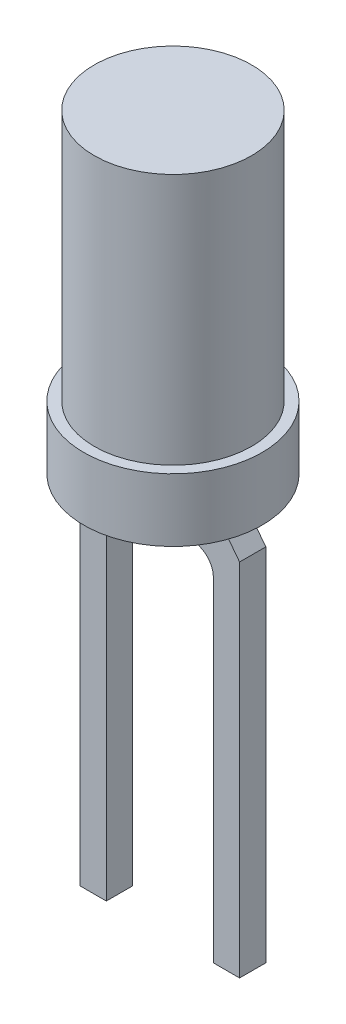
ISO-10303-21;
HEADER;
FILE_DESCRIPTION(('STEP AP214'),'2;1');
FILE_NAME('part.step','',(''),(''),'','','');
FILE_SCHEMA(('AUTOMOTIVE_DESIGN { 1 0 10303 214 1 1 1 1 }'));
ENDSEC;
DATA;
#1=APPLICATION_CONTEXT('core data for automotive mechanical design processes');
#2=APPLICATION_PROTOCOL_DEFINITION('international standard','automotive_design',2000,#1);
#3=PRODUCT_CONTEXT('',#1,'mechanical');
#4=PRODUCT('Part','Part','',(#3));
#5=PRODUCT_RELATED_PRODUCT_CATEGORY('part','',(#4));
#6=PRODUCT_DEFINITION_FORMATION('','',#4);
#7=PRODUCT_DEFINITION_CONTEXT('part definition',#1,'design');
#8=PRODUCT_DEFINITION('design','',#6,#7);
#9=PRODUCT_DEFINITION_SHAPE('','',#8);
#10=(LENGTH_UNIT() NAMED_UNIT(*) SI_UNIT(.MILLI.,.METRE.));
#11=(NAMED_UNIT(*) PLANE_ANGLE_UNIT() SI_UNIT($,.RADIAN.));
#12=(NAMED_UNIT(*) SI_UNIT($,.STERADIAN.) SOLID_ANGLE_UNIT());
#13=UNCERTAINTY_MEASURE_WITH_UNIT(LENGTH_MEASURE(1.E-05),#10,'distance_accuracy_value','');
#14=(GEOMETRIC_REPRESENTATION_CONTEXT(3) GLOBAL_UNCERTAINTY_ASSIGNED_CONTEXT((#13)) GLOBAL_UNIT_ASSIGNED_CONTEXT((#10,
#11,#12)) REPRESENTATION_CONTEXT('',''));
#15=CARTESIAN_POINT('',(0.,0.,0.));
#16=DIRECTION('',(0.,0.,1.));
#17=DIRECTION('',(1.,0.,0.));
#18=AXIS2_PLACEMENT_3D('',#15,#16,#17);
#19=CARTESIAN_POINT('',(0.,-6.,0.));
#20=DIRECTION('',(0.,-1.,0.));
#21=DIRECTION('',(0.,0.,-1.));
#22=AXIS2_PLACEMENT_3D('',#19,#20,#21);
#23=PLANE('',#22);
#24=CARTESIAN_POINT('',(0.,-6.,0.));
#25=DIRECTION('',(0.,-1.,0.));
#26=DIRECTION('',(0.,0.,-1.));
#27=AXIS2_PLACEMENT_3D('',#24,#25,#26);
#28=CIRCLE('',#27,1.7);
#29=CARTESIAN_POINT('',(0.,-6.,-1.7));
#30=VERTEX_POINT('',#29);
#31=EDGE_CURVE('E294',#30,#30,#28,.T.);
#32=ORIENTED_EDGE('',*,*,#31,.T.);
#33=EDGE_LOOP('',(#32));
#34=FACE_BOUND('',#33,.T.);
#35=DIRECTION('',(-1.,0.,0.));
#36=VECTOR('',#35,1.);
#37=CARTESIAN_POINT('',(1.08406668238665,-6.,-0.25));
#38=LINE('',#37,#36);
#39=CARTESIAN_POINT('',(1.08406668238665,-6.,-0.25));
#40=VERTEX_POINT('',#39);
#41=CARTESIAN_POINT('',(0.5,-6.,-0.25));
#42=VERTEX_POINT('',#41);
#43=EDGE_CURVE('E247',#40,#42,#38,.T.);
#44=ORIENTED_EDGE('',*,*,#43,.T.);
#45=DIRECTION('',(0.,0.,1.));
#46=VECTOR('',#45,1.);
#47=CARTESIAN_POINT('',(0.5,-6.,-0.25));
#48=LINE('',#47,#46);
#49=CARTESIAN_POINT('',(0.5,-6.,0.25));
#50=VERTEX_POINT('',#49);
#51=EDGE_CURVE('E274',#42,#50,#48,.T.);
#52=ORIENTED_EDGE('',*,*,#51,.T.);
#53=DIRECTION('',(-1.,0.,0.));
#54=VECTOR('',#53,1.);
#55=CARTESIAN_POINT('',(1.08406668238665,-6.,0.25));
#56=LINE('',#55,#54);
#57=CARTESIAN_POINT('',(1.08406668238665,-6.,0.25));
#58=VERTEX_POINT('',#57);
#59=EDGE_CURVE('E211',#58,#50,#56,.T.);
#60=ORIENTED_EDGE('',*,*,#59,.F.);
#61=DIRECTION('',(0.,0.,1.));
#62=VECTOR('',#61,1.);
#63=CARTESIAN_POINT('',(1.08406668238665,-6.,-0.25));
#64=LINE('',#63,#62);
#65=EDGE_CURVE('E275',#40,#58,#64,.T.);
#66=ORIENTED_EDGE('',*,*,#65,.F.);
#67=EDGE_LOOP('',(#44,#52,#60,#66));
#68=FACE_BOUND('',#67,.T.);
#69=DIRECTION('',(0.,0.,1.));
#70=VECTOR('',#69,1.);
#71=CARTESIAN_POINT('',(-0.5,-6.,-0.25));
#72=LINE('',#71,#70);
#73=CARTESIAN_POINT('',(-0.5,-6.,-0.25));
#74=VERTEX_POINT('',#73);
#75=CARTESIAN_POINT('',(-0.5,-6.,0.25));
#76=VERTEX_POINT('',#75);
#77=EDGE_CURVE('E57',#74,#76,#72,.T.);
#78=ORIENTED_EDGE('',*,*,#77,.F.);
#79=DIRECTION('',(-1.,0.,0.));
#80=VECTOR('',#79,1.);
#81=CARTESIAN_POINT('',(-1.08406668238665,-6.,-0.25));
#82=LINE('',#81,#80);
#83=CARTESIAN_POINT('',(-1.08406668238665,-6.,-0.25));
#84=VERTEX_POINT('',#83);
#85=EDGE_CURVE('E52',#74,#84,#82,.T.);
#86=ORIENTED_EDGE('',*,*,#85,.T.);
#87=DIRECTION('',(0.,0.,1.));
#88=VECTOR('',#87,1.);
#89=CARTESIAN_POINT('',(-1.08406668238665,-6.,-0.25));
#90=LINE('',#89,#88);
#91=CARTESIAN_POINT('',(-1.08406668238665,-6.,0.25));
#92=VERTEX_POINT('',#91);
#93=EDGE_CURVE('E218',#84,#92,#90,.T.);
#94=ORIENTED_EDGE('',*,*,#93,.T.);
#95=DIRECTION('',(-1.,0.,0.));
#96=VECTOR('',#95,1.);
#97=CARTESIAN_POINT('',(-1.08406668238665,-6.,0.25));
#98=LINE('',#97,#96);
#99=EDGE_CURVE('E179',#76,#92,#98,.T.);
#100=ORIENTED_EDGE('',*,*,#99,.F.);
#101=EDGE_LOOP('',(#78,#86,#94,#100));
#102=FACE_BOUND('',#101,.T.);
#103=ADVANCED_FACE('F37',(#34,#68,#102),#23,.T.);
#104=CARTESIAN_POINT('',(0.,-4.8,0.));
#105=DIRECTION('',(0.,1.,0.));
#106=DIRECTION('',(0.,0.,1.));
#107=AXIS2_PLACEMENT_3D('',#104,#105,#106);
#108=CYLINDRICAL_SURFACE('',#107,1.5);
#109=CARTESIAN_POINT('',(0.,-4.8,0.));
#110=DIRECTION('',(0.,-1.,0.));
#111=DIRECTION('',(0.,0.,-1.));
#112=AXIS2_PLACEMENT_3D('',#109,#110,#111);
#113=CIRCLE('',#112,1.5);
#114=CARTESIAN_POINT('',(0.,-4.8,-1.5));
#115=VERTEX_POINT('',#114);
#116=EDGE_CURVE('E45',#115,#115,#113,.F.);
#117=ORIENTED_EDGE('',*,*,#116,.T.);
#118=EDGE_LOOP('',(#117));
#119=FACE_BOUND('',#118,.T.);
#120=CARTESIAN_POINT('',(0.,0.,0.));
#121=DIRECTION('',(0.,1.,0.));
#122=DIRECTION('',(0.,0.,1.));
#123=AXIS2_PLACEMENT_3D('',#120,#121,#122);
#124=CIRCLE('',#123,1.5);
#125=CARTESIAN_POINT('',(0.,0.,1.5));
#126=VERTEX_POINT('',#125);
#127=EDGE_CURVE('E11',#126,#126,#124,.T.);
#128=ORIENTED_EDGE('',*,*,#127,.F.);
#129=EDGE_LOOP('',(#128));
#130=FACE_BOUND('',#129,.T.);
#131=ADVANCED_FACE('F39',(#119,#130),#108,.T.);
#132=CARTESIAN_POINT('',(0.,0.,0.));
#133=DIRECTION('',(0.,1.,0.));
#134=DIRECTION('',(0.,0.,1.));
#135=AXIS2_PLACEMENT_3D('',#132,#133,#134);
#136=PLANE('',#135);
#137=ORIENTED_EDGE('',*,*,#127,.T.);
#138=EDGE_LOOP('',(#137));
#139=FACE_BOUND('',#138,.T.);
#140=ADVANCED_FACE('F312',(#139),#136,.T.);
#141=CARTESIAN_POINT('',(0.,-6.,0.));
#142=DIRECTION('',(0.,1.,0.));
#143=DIRECTION('',(0.,0.,1.));
#144=AXIS2_PLACEMENT_3D('',#141,#142,#143);
#145=CYLINDRICAL_SURFACE('',#144,1.7);
#146=ORIENTED_EDGE('',*,*,#31,.F.);
#147=EDGE_LOOP('',(#146));
#148=FACE_BOUND('',#147,.T.);
#149=CARTESIAN_POINT('',(0.,-4.8,0.));
#150=DIRECTION('',(0.,-1.,0.));
#151=DIRECTION('',(0.,0.,-1.));
#152=AXIS2_PLACEMENT_3D('',#149,#150,#151);
#153=CIRCLE('',#152,1.7);
#154=CARTESIAN_POINT('',(0.,-4.8,-1.7));
#155=VERTEX_POINT('',#154);
#156=EDGE_CURVE('E278',#155,#155,#153,.T.);
#157=ORIENTED_EDGE('',*,*,#156,.T.);
#158=EDGE_LOOP('',(#157));
#159=FACE_BOUND('',#158,.T.);
#160=ADVANCED_FACE('F307',(#148,#159),#145,.T.);
#161=CARTESIAN_POINT('',(0.,-4.8,0.));
#162=DIRECTION('',(0.,-1.,0.));
#163=DIRECTION('',(0.,0.,-1.));
#164=AXIS2_PLACEMENT_3D('',#161,#162,#163);
#165=PLANE('',#164);
#166=ORIENTED_EDGE('',*,*,#116,.F.);
#167=EDGE_LOOP('',(#166));
#168=FACE_BOUND('',#167,.T.);
#169=ORIENTED_EDGE('',*,*,#156,.F.);
#170=EDGE_LOOP('',(#169));
#171=FACE_BOUND('',#170,.T.);
#172=ADVANCED_FACE('F303',(#168,#171),#165,.F.);
#173=CARTESIAN_POINT('',(1.52,-6.57249783833724,-0.25));
#174=DIRECTION('',(0.795602863014056,0.60581852428251,0.));
#175=DIRECTION('',(-0.60581852428251,0.795602863014056,0.));
#176=AXIS2_PLACEMENT_3D('',#173,#174,#175);
#177=PLANE('',#176);
#178=ORIENTED_EDGE('',*,*,#65,.T.);
#179=DIRECTION('',(-0.60581852428251,0.795602863014055,0.));
#180=VECTOR('',#179,1.);
#181=CARTESIAN_POINT('',(1.52,-6.57249783833724,0.25));
#182=LINE('',#181,#180);
#183=CARTESIAN_POINT('',(1.52,-6.57249783833724,0.25));
#184=VERTEX_POINT('',#183);
#185=EDGE_CURVE('E245',#184,#58,#182,.T.);
#186=ORIENTED_EDGE('',*,*,#185,.F.);
#187=DIRECTION('',(0.,0.,1.));
#188=VECTOR('',#187,1.);
#189=CARTESIAN_POINT('',(1.52,-6.57249783833724,-0.25));
#190=LINE('',#189,#188);
#191=CARTESIAN_POINT('',(1.52,-6.57249783833724,-0.25));
#192=VERTEX_POINT('',#191);
#193=EDGE_CURVE('E279',#192,#184,#190,.T.);
#194=ORIENTED_EDGE('',*,*,#193,.F.);
#195=DIRECTION('',(-0.60581852428251,0.795602863014055,0.));
#196=VECTOR('',#195,1.);
#197=CARTESIAN_POINT('',(1.52,-6.57249783833724,-0.25));
#198=LINE('',#197,#196);
#199=EDGE_CURVE('E271',#192,#40,#198,.T.);
#200=ORIENTED_EDGE('',*,*,#199,.T.);
#201=EDGE_LOOP('',(#178,#186,#194,#200));
#202=FACE_BOUND('',#201,.T.);
#203=ADVANCED_FACE('F306',(#202),#177,.T.);
#204=CARTESIAN_POINT('',(1.52,-13.4396370979597,-0.25));
#205=DIRECTION('',(1.,0.,0.));
#206=DIRECTION('',(0.,1.,0.));
#207=AXIS2_PLACEMENT_3D('',#204,#205,#206);
#208=PLANE('',#207);
#209=ORIENTED_EDGE('',*,*,#193,.T.);
#210=DIRECTION('',(0.,1.,0.));
#211=VECTOR('',#210,1.);
#212=CARTESIAN_POINT('',(1.52,-13.4396370979597,0.25));
#213=LINE('',#212,#211);
#214=CARTESIAN_POINT('',(1.52,-13.4396370979597,0.25));
#215=VERTEX_POINT('',#214);
#216=EDGE_CURVE('E241',#215,#184,#213,.T.);
#217=ORIENTED_EDGE('',*,*,#216,.F.);
#218=DIRECTION('',(0.,0.,1.));
#219=VECTOR('',#218,1.);
#220=CARTESIAN_POINT('',(1.52,-13.4396370979597,-0.25));
#221=LINE('',#220,#219);
#222=CARTESIAN_POINT('',(1.52,-13.4396370979597,-0.25));
#223=VERTEX_POINT('',#222);
#224=EDGE_CURVE('E281',#223,#215,#221,.T.);
#225=ORIENTED_EDGE('',*,*,#224,.F.);
#226=DIRECTION('',(0.,1.,0.));
#227=VECTOR('',#226,1.);
#228=CARTESIAN_POINT('',(1.52,-13.4396370979597,-0.25));
#229=LINE('',#228,#227);
#230=EDGE_CURVE('E267',#223,#192,#229,.T.);
#231=ORIENTED_EDGE('',*,*,#230,.T.);
#232=EDGE_LOOP('',(#209,#217,#225,#231));
#233=FACE_BOUND('',#232,.T.);
#234=ADVANCED_FACE('F348',(#233),#208,.T.);
#235=CARTESIAN_POINT('',(1.02,-13.4396370979597,-0.25));
#236=DIRECTION('',(0.,-1.,0.));
#237=DIRECTION('',(0.,0.,-1.));
#238=AXIS2_PLACEMENT_3D('',#235,#236,#237);
#239=PLANE('',#238);
#240=ORIENTED_EDGE('',*,*,#224,.T.);
#241=DIRECTION('',(1.,0.,0.));
#242=VECTOR('',#241,1.);
#243=CARTESIAN_POINT('',(1.02,-13.4396370979597,0.25));
#244=LINE('',#243,#242);
#245=CARTESIAN_POINT('',(1.02,-13.4396370979597,0.25));
#246=VERTEX_POINT('',#245);
#247=EDGE_CURVE('E237',#246,#215,#244,.T.);
#248=ORIENTED_EDGE('',*,*,#247,.F.);
#249=DIRECTION('',(0.,0.,1.));
#250=VECTOR('',#249,1.);
#251=CARTESIAN_POINT('',(1.02,-13.4396370979597,-0.25));
#252=LINE('',#251,#250);
#253=CARTESIAN_POINT('',(1.02,-13.4396370979597,-0.25));
#254=VERTEX_POINT('',#253);
#255=EDGE_CURVE('E283',#254,#246,#252,.T.);
#256=ORIENTED_EDGE('',*,*,#255,.F.);
#257=DIRECTION('',(1.,0.,0.));
#258=VECTOR('',#257,1.);
#259=CARTESIAN_POINT('',(1.02,-13.4396370979597,-0.25));
#260=LINE('',#259,#258);
#261=EDGE_CURVE('E263',#254,#223,#260,.T.);
#262=ORIENTED_EDGE('',*,*,#261,.T.);
#263=EDGE_LOOP('',(#240,#248,#256,#262));
#264=FACE_BOUND('',#263,.T.);
#265=ADVANCED_FACE('F344',(#264),#239,.T.);
#266=CARTESIAN_POINT('',(1.02,-7.07249783833724,-0.25));
#267=DIRECTION('',(-1.,0.,0.));
#268=DIRECTION('',(0.,0.,1.));
#269=AXIS2_PLACEMENT_3D('',#266,#267,#268);
#270=PLANE('',#269);
#271=ORIENTED_EDGE('',*,*,#255,.T.);
#272=DIRECTION('',(0.,-1.,0.));
#273=VECTOR('',#272,1.);
#274=CARTESIAN_POINT('',(1.02,-7.07249783833724,0.25));
#275=LINE('',#274,#273);
#276=CARTESIAN_POINT('',(1.02,-7.07249783833724,0.25));
#277=VERTEX_POINT('',#276);
#278=EDGE_CURVE('E233',#277,#246,#275,.T.);
#279=ORIENTED_EDGE('',*,*,#278,.F.);
#280=DIRECTION('',(0.,0.,1.));
#281=VECTOR('',#280,1.);
#282=CARTESIAN_POINT('',(1.02,-7.07249783833724,-0.25));
#283=LINE('',#282,#281);
#284=CARTESIAN_POINT('',(1.02,-7.07249783833724,-0.25));
#285=VERTEX_POINT('',#284);
#286=EDGE_CURVE('E286',#285,#277,#283,.T.);
#287=ORIENTED_EDGE('',*,*,#286,.F.);
#288=DIRECTION('',(0.,-1.,0.));
#289=VECTOR('',#288,1.);
#290=CARTESIAN_POINT('',(1.02,-7.07249783833724,-0.25));
#291=LINE('',#290,#289);
#292=EDGE_CURVE('E259',#285,#254,#291,.T.);
#293=ORIENTED_EDGE('',*,*,#292,.T.);
#294=EDGE_LOOP('',(#271,#279,#287,#293));
#295=FACE_BOUND('',#294,.T.);
#296=ADVANCED_FACE('F340',(#295),#270,.T.);
#297=CARTESIAN_POINT('',(0.62,-7.07249783833724,-0.25));
#298=DIRECTION('',(0.,0.,1.));
#299=DIRECTION('',(1.,0.,0.));
#300=AXIS2_PLACEMENT_3D('',#297,#298,#299);
#301=CYLINDRICAL_SURFACE('',#300,0.4);
#302=ORIENTED_EDGE('',*,*,#286,.T.);
#303=CARTESIAN_POINT('',(0.62,-7.07249783833724,0.25));
#304=DIRECTION('',(0.,0.,-1.));
#305=DIRECTION('',(-1.,0.,0.));
#306=AXIS2_PLACEMENT_3D('',#303,#304,#305);
#307=CIRCLE('',#306,0.4);
#308=CARTESIAN_POINT('',(0.62,-6.67249783833724,0.25));
#309=VERTEX_POINT('',#308);
#310=EDGE_CURVE('E230',#309,#277,#307,.T.);
#311=ORIENTED_EDGE('',*,*,#310,.F.);
#312=DIRECTION('',(0.,0.,1.));
#313=VECTOR('',#312,1.);
#314=CARTESIAN_POINT('',(0.62,-6.67249783833724,-0.25));
#315=LINE('',#314,#313);
#316=CARTESIAN_POINT('',(0.62,-6.67249783833724,-0.25));
#317=VERTEX_POINT('',#316);
#318=EDGE_CURVE('E288',#317,#309,#315,.T.);
#319=ORIENTED_EDGE('',*,*,#318,.F.);
#320=CARTESIAN_POINT('',(0.62,-7.07249783833724,-0.25));
#321=DIRECTION('',(0.,0.,-1.));
#322=DIRECTION('',(-1.,0.,0.));
#323=AXIS2_PLACEMENT_3D('',#320,#321,#322);
#324=CIRCLE('',#323,0.4);
#325=EDGE_CURVE('E256',#317,#285,#324,.T.);
#326=ORIENTED_EDGE('',*,*,#325,.T.);
#327=EDGE_LOOP('',(#302,#311,#319,#326));
#328=FACE_BOUND('',#327,.T.);
#329=ADVANCED_FACE('F336',(#328),#301,.F.);
#330=CARTESIAN_POINT('',(0.5,-6.67249783833724,-0.25));
#331=DIRECTION('',(0.,-1.,0.));
#332=DIRECTION('',(0.,0.,-1.));
#333=AXIS2_PLACEMENT_3D('',#330,#331,#332);
#334=PLANE('',#333);
#335=ORIENTED_EDGE('',*,*,#318,.T.);
#336=DIRECTION('',(1.,0.,0.));
#337=VECTOR('',#336,1.);
#338=CARTESIAN_POINT('',(0.5,-6.67249783833724,0.25));
#339=LINE('',#338,#337);
#340=CARTESIAN_POINT('',(0.5,-6.67249783833724,0.25));
#341=VERTEX_POINT('',#340);
#342=EDGE_CURVE('E227',#341,#309,#339,.T.);
#343=ORIENTED_EDGE('',*,*,#342,.F.);
#344=DIRECTION('',(0.,0.,1.));
#345=VECTOR('',#344,1.);
#346=CARTESIAN_POINT('',(0.5,-6.67249783833724,-0.25));
#347=LINE('',#346,#345);
#348=CARTESIAN_POINT('',(0.5,-6.67249783833724,-0.25));
#349=VERTEX_POINT('',#348);
#350=EDGE_CURVE('E290',#349,#341,#347,.T.);
#351=ORIENTED_EDGE('',*,*,#350,.F.);
#352=DIRECTION('',(1.,0.,0.));
#353=VECTOR('',#352,1.);
#354=CARTESIAN_POINT('',(0.5,-6.67249783833724,-0.25));
#355=LINE('',#354,#353);
#356=EDGE_CURVE('E253',#349,#317,#355,.T.);
#357=ORIENTED_EDGE('',*,*,#356,.T.);
#358=EDGE_LOOP('',(#335,#343,#351,#357));
#359=FACE_BOUND('',#358,.T.);
#360=ADVANCED_FACE('F332',(#359),#334,.T.);
#361=CARTESIAN_POINT('',(0.5,-6.,-0.25));
#362=DIRECTION('',(-1.,0.,0.));
#363=DIRECTION('',(0.,-1.,0.));
#364=AXIS2_PLACEMENT_3D('',#361,#362,#363);
#365=PLANE('',#364);
#366=ORIENTED_EDGE('',*,*,#350,.T.);
#367=DIRECTION('',(0.,-1.,0.));
#368=VECTOR('',#367,1.);
#369=CARTESIAN_POINT('',(0.5,-6.,0.25));
#370=LINE('',#369,#368);
#371=EDGE_CURVE('E224',#50,#341,#370,.T.);
#372=ORIENTED_EDGE('',*,*,#371,.F.);
#373=ORIENTED_EDGE('',*,*,#51,.F.);
#374=DIRECTION('',(0.,-1.,0.));
#375=VECTOR('',#374,1.);
#376=CARTESIAN_POINT('',(0.5,-6.,-0.25));
#377=LINE('',#376,#375);
#378=EDGE_CURVE('E250',#42,#349,#377,.T.);
#379=ORIENTED_EDGE('',*,*,#378,.T.);
#380=EDGE_LOOP('',(#366,#372,#373,#379));
#381=FACE_BOUND('',#380,.T.);
#382=ADVANCED_FACE('F328',(#381),#365,.T.);
#383=CARTESIAN_POINT('',(0.62,-7.07249783833724,-0.25));
#384=DIRECTION('',(0.,0.,-1.));
#385=DIRECTION('',(-1.,0.,0.));
#386=AXIS2_PLACEMENT_3D('',#383,#384,#385);
#387=PLANE('',#386);
#388=ORIENTED_EDGE('',*,*,#43,.F.);
#389=ORIENTED_EDGE('',*,*,#199,.F.);
#390=ORIENTED_EDGE('',*,*,#230,.F.);
#391=ORIENTED_EDGE('',*,*,#261,.F.);
#392=ORIENTED_EDGE('',*,*,#292,.F.);
#393=ORIENTED_EDGE('',*,*,#325,.F.);
#394=ORIENTED_EDGE('',*,*,#356,.F.);
#395=ORIENTED_EDGE('',*,*,#378,.F.);
#396=EDGE_LOOP('',(#388,#389,#390,#391,#392,#393,#394,#395));
#397=FACE_BOUND('',#396,.T.);
#398=ADVANCED_FACE('F331',(#397),#387,.T.);
#399=CARTESIAN_POINT('',(0.62,-7.07249783833724,0.25));
#400=DIRECTION('',(0.,0.,-1.));
#401=DIRECTION('',(-1.,0.,0.));
#402=AXIS2_PLACEMENT_3D('',#399,#400,#401);
#403=PLANE('',#402);
#404=ORIENTED_EDGE('',*,*,#59,.T.);
#405=ORIENTED_EDGE('',*,*,#371,.T.);
#406=ORIENTED_EDGE('',*,*,#342,.T.);
#407=ORIENTED_EDGE('',*,*,#310,.T.);
#408=ORIENTED_EDGE('',*,*,#278,.T.);
#409=ORIENTED_EDGE('',*,*,#247,.T.);
#410=ORIENTED_EDGE('',*,*,#216,.T.);
#411=ORIENTED_EDGE('',*,*,#185,.T.);
#412=EDGE_LOOP('',(#404,#405,#406,#407,#408,#409,#410,#411));
#413=FACE_BOUND('',#412,.T.);
#414=ADVANCED_FACE('F358',(#413),#403,.F.);
#415=CARTESIAN_POINT('',(-0.62,-7.07249783833724,-0.25));
#416=DIRECTION('',(0.,0.,1.));
#417=DIRECTION('',(1.,0.,0.));
#418=AXIS2_PLACEMENT_3D('',#415,#416,#417);
#419=CYLINDRICAL_SURFACE('',#418,0.4);
#420=DIRECTION('',(0.,0.,1.));
#421=VECTOR('',#420,1.);
#422=CARTESIAN_POINT('',(-0.62,-6.67249783833724,-0.25));
#423=LINE('',#422,#421);
#424=CARTESIAN_POINT('',(-0.62,-6.67249783833724,-0.25));
#425=VERTEX_POINT('',#424);
#426=CARTESIAN_POINT('',(-0.62,-6.67249783833724,0.25));
#427=VERTEX_POINT('',#426);
#428=EDGE_CURVE('E150',#425,#427,#423,.T.);
#429=ORIENTED_EDGE('',*,*,#428,.T.);
#430=CARTESIAN_POINT('',(-0.62,-7.07249783833724,0.25));
#431=DIRECTION('',(0.,0.,-1.));
#432=DIRECTION('',(1.,0.,0.));
#433=AXIS2_PLACEMENT_3D('',#430,#431,#432);
#434=CIRCLE('',#433,0.4);
#435=CARTESIAN_POINT('',(-1.02,-7.07249783833724,0.25));
#436=VERTEX_POINT('',#435);
#437=EDGE_CURVE('E154',#436,#427,#434,.T.);
#438=ORIENTED_EDGE('',*,*,#437,.F.);
#439=DIRECTION('',(0.,0.,1.));
#440=VECTOR('',#439,1.);
#441=CARTESIAN_POINT('',(-1.02,-7.07249783833724,-0.25));
#442=LINE('',#441,#440);
#443=CARTESIAN_POINT('',(-1.02,-7.07249783833724,-0.25));
#444=VERTEX_POINT('',#443);
#445=EDGE_CURVE('E209',#444,#436,#442,.T.);
#446=ORIENTED_EDGE('',*,*,#445,.F.);
#447=CARTESIAN_POINT('',(-0.62,-7.07249783833724,-0.25));
#448=DIRECTION('',(0.,0.,-1.));
#449=DIRECTION('',(1.,0.,0.));
#450=AXIS2_PLACEMENT_3D('',#447,#448,#449);
#451=CIRCLE('',#450,0.4);
#452=EDGE_CURVE('E156',#444,#425,#451,.T.);
#453=ORIENTED_EDGE('',*,*,#452,.T.);
#454=EDGE_LOOP('',(#429,#438,#446,#453));
#455=FACE_BOUND('',#454,.T.);
#456=ADVANCED_FACE('F152',(#455),#419,.F.);
#457=CARTESIAN_POINT('',(-1.02,-7.07249783833724,-0.25));
#458=DIRECTION('',(1.,0.,0.));
#459=DIRECTION('',(0.,0.,-1.));
#460=AXIS2_PLACEMENT_3D('',#457,#458,#459);
#461=PLANE('',#460);
#462=ORIENTED_EDGE('',*,*,#445,.T.);
#463=DIRECTION('',(0.,1.,0.));
#464=VECTOR('',#463,1.);
#465=CARTESIAN_POINT('',(-1.02,-7.07249783833724,0.25));
#466=LINE('',#465,#464);
#467=CARTESIAN_POINT('',(-1.02,-13.4396370979597,0.25));
#468=VERTEX_POINT('',#467);
#469=EDGE_CURVE('E175',#468,#436,#466,.T.);
#470=ORIENTED_EDGE('',*,*,#469,.F.);
#471=DIRECTION('',(0.,0.,1.));
#472=VECTOR('',#471,1.);
#473=CARTESIAN_POINT('',(-1.02,-13.4396370979597,-0.25));
#474=LINE('',#473,#472);
#475=CARTESIAN_POINT('',(-1.02,-13.4396370979597,-0.25));
#476=VERTEX_POINT('',#475);
#477=EDGE_CURVE('E212',#476,#468,#474,.T.);
#478=ORIENTED_EDGE('',*,*,#477,.F.);
#479=DIRECTION('',(0.,1.,0.));
#480=VECTOR('',#479,1.);
#481=CARTESIAN_POINT('',(-1.02,-7.07249783833724,-0.25));
#482=LINE('',#481,#480);
#483=EDGE_CURVE('E161',#476,#444,#482,.T.);
#484=ORIENTED_EDGE('',*,*,#483,.T.);
#485=EDGE_LOOP('',(#462,#470,#478,#484));
#486=FACE_BOUND('',#485,.T.);
#487=ADVANCED_FACE('F365',(#486),#461,.T.);
#488=CARTESIAN_POINT('',(-1.52,-13.4396370979597,-0.25));
#489=DIRECTION('',(0.,-1.,0.));
#490=DIRECTION('',(0.,0.,-1.));
#491=AXIS2_PLACEMENT_3D('',#488,#489,#490);
#492=PLANE('',#491);
#493=ORIENTED_EDGE('',*,*,#477,.T.);
#494=DIRECTION('',(1.,0.,0.));
#495=VECTOR('',#494,1.);
#496=CARTESIAN_POINT('',(-1.52,-13.4396370979597,0.25));
#497=LINE('',#496,#495);
#498=CARTESIAN_POINT('',(-1.52,-13.4396370979597,0.25));
#499=VERTEX_POINT('',#498);
#500=EDGE_CURVE('E188',#499,#468,#497,.T.);
#501=ORIENTED_EDGE('',*,*,#500,.F.);
#502=DIRECTION('',(0.,0.,1.));
#503=VECTOR('',#502,1.);
#504=CARTESIAN_POINT('',(-1.52,-13.4396370979597,-0.25));
#505=LINE('',#504,#503);
#506=CARTESIAN_POINT('',(-1.52,-13.4396370979597,-0.25));
#507=VERTEX_POINT('',#506);
#508=EDGE_CURVE('E214',#507,#499,#505,.T.);
#509=ORIENTED_EDGE('',*,*,#508,.F.);
#510=DIRECTION('',(1.,0.,0.));
#511=VECTOR('',#510,1.);
#512=CARTESIAN_POINT('',(-1.52,-13.4396370979597,-0.25));
#513=LINE('',#512,#511);
#514=EDGE_CURVE('E204',#507,#476,#513,.T.);
#515=ORIENTED_EDGE('',*,*,#514,.T.);
#516=EDGE_LOOP('',(#493,#501,#509,#515));
#517=FACE_BOUND('',#516,.T.);
#518=ADVANCED_FACE('F380',(#517),#492,.T.);
#519=CARTESIAN_POINT('',(-1.52,-13.4396370979597,-0.25));
#520=DIRECTION('',(-1.,0.,0.));
#521=DIRECTION('',(0.,-1.,0.));
#522=AXIS2_PLACEMENT_3D('',#519,#520,#521);
#523=PLANE('',#522);
#524=ORIENTED_EDGE('',*,*,#508,.T.);
#525=DIRECTION('',(0.,-1.,0.));
#526=VECTOR('',#525,1.);
#527=CARTESIAN_POINT('',(-1.52,-13.4396370979597,0.25));
#528=LINE('',#527,#526);
#529=CARTESIAN_POINT('',(-1.52,-6.57249783833724,0.25));
#530=VERTEX_POINT('',#529);
#531=EDGE_CURVE('E185',#530,#499,#528,.T.);
#532=ORIENTED_EDGE('',*,*,#531,.F.);
#533=DIRECTION('',(0.,0.,1.));
#534=VECTOR('',#533,1.);
#535=CARTESIAN_POINT('',(-1.52,-6.57249783833724,-0.25));
#536=LINE('',#535,#534);
#537=CARTESIAN_POINT('',(-1.52,-6.57249783833724,-0.25));
#538=VERTEX_POINT('',#537);
#539=EDGE_CURVE('E216',#538,#530,#536,.T.);
#540=ORIENTED_EDGE('',*,*,#539,.F.);
#541=DIRECTION('',(0.,-1.,0.));
#542=VECTOR('',#541,1.);
#543=CARTESIAN_POINT('',(-1.52,-13.4396370979597,-0.25));
#544=LINE('',#543,#542);
#545=EDGE_CURVE('E201',#538,#507,#544,.T.);
#546=ORIENTED_EDGE('',*,*,#545,.T.);
#547=EDGE_LOOP('',(#524,#532,#540,#546));
#548=FACE_BOUND('',#547,.T.);
#549=ADVANCED_FACE('F376',(#548),#523,.T.);
#550=CARTESIAN_POINT('',(-1.52,-6.57249783833724,-0.25));
#551=DIRECTION('',(-0.795602863014056,0.60581852428251,0.));
#552=DIRECTION('',(-0.60581852428251,-0.795602863014056,0.));
#553=AXIS2_PLACEMENT_3D('',#550,#551,#552);
#554=PLANE('',#553);
#555=ORIENTED_EDGE('',*,*,#539,.T.);
#556=DIRECTION('',(-0.60581852428251,-0.795602863014055,0.));
#557=VECTOR('',#556,1.);
#558=CARTESIAN_POINT('',(-1.52,-6.57249783833724,0.25));
#559=LINE('',#558,#557);
#560=EDGE_CURVE('E182',#92,#530,#559,.T.);
#561=ORIENTED_EDGE('',*,*,#560,.F.);
#562=ORIENTED_EDGE('',*,*,#93,.F.);
#563=DIRECTION('',(-0.60581852428251,-0.795602863014055,0.));
#564=VECTOR('',#563,1.);
#565=CARTESIAN_POINT('',(-1.52,-6.57249783833724,-0.25));
#566=LINE('',#565,#564);
#567=EDGE_CURVE('E198',#84,#538,#566,.T.);
#568=ORIENTED_EDGE('',*,*,#567,.T.);
#569=EDGE_LOOP('',(#555,#561,#562,#568));
#570=FACE_BOUND('',#569,.T.);
#571=ADVANCED_FACE('F372',(#570),#554,.T.);
#572=CARTESIAN_POINT('',(-0.5,-6.,-0.25));
#573=DIRECTION('',(1.,0.,0.));
#574=DIRECTION('',(0.,1.,0.));
#575=AXIS2_PLACEMENT_3D('',#572,#573,#574);
#576=PLANE('',#575);
#577=ORIENTED_EDGE('',*,*,#77,.T.);
#578=DIRECTION('',(0.,1.,0.));
#579=VECTOR('',#578,1.);
#580=CARTESIAN_POINT('',(-0.5,-6.,0.25));
#581=LINE('',#580,#579);
#582=CARTESIAN_POINT('',(-0.5,-6.67249783833724,0.25));
#583=VERTEX_POINT('',#582);
#584=EDGE_CURVE('E169',#583,#76,#581,.T.);
#585=ORIENTED_EDGE('',*,*,#584,.F.);
#586=DIRECTION('',(0.,0.,1.));
#587=VECTOR('',#586,1.);
#588=CARTESIAN_POINT('',(-0.5,-6.67249783833724,-0.25));
#589=LINE('',#588,#587);
#590=CARTESIAN_POINT('',(-0.5,-6.67249783833724,-0.25));
#591=VERTEX_POINT('',#590);
#592=EDGE_CURVE('E160',#591,#583,#589,.T.);
#593=ORIENTED_EDGE('',*,*,#592,.F.);
#594=DIRECTION('',(0.,1.,0.));
#595=VECTOR('',#594,1.);
#596=CARTESIAN_POINT('',(-0.5,-6.,-0.25));
#597=LINE('',#596,#595);
#598=EDGE_CURVE('E194',#591,#74,#597,.T.);
#599=ORIENTED_EDGE('',*,*,#598,.T.);
#600=EDGE_LOOP('',(#577,#585,#593,#599));
#601=FACE_BOUND('',#600,.T.);
#602=ADVANCED_FACE('F369',(#601),#576,.T.);
#603=CARTESIAN_POINT('',(-0.5,-6.67249783833724,-0.25));
#604=DIRECTION('',(0.,-1.,0.));
#605=DIRECTION('',(0.,0.,-1.));
#606=AXIS2_PLACEMENT_3D('',#603,#604,#605);
#607=PLANE('',#606);
#608=ORIENTED_EDGE('',*,*,#592,.T.);
#609=DIRECTION('',(1.,0.,0.));
#610=VECTOR('',#609,1.);
#611=CARTESIAN_POINT('',(-0.5,-6.67249783833724,0.25));
#612=LINE('',#611,#610);
#613=EDGE_CURVE('E164',#427,#583,#612,.T.);
#614=ORIENTED_EDGE('',*,*,#613,.F.);
#615=ORIENTED_EDGE('',*,*,#428,.F.);
#616=DIRECTION('',(1.,0.,0.));
#617=VECTOR('',#616,1.);
#618=CARTESIAN_POINT('',(-0.5,-6.67249783833724,-0.25));
#619=LINE('',#618,#617);
#620=EDGE_CURVE('E192',#425,#591,#619,.T.);
#621=ORIENTED_EDGE('',*,*,#620,.T.);
#622=EDGE_LOOP('',(#608,#614,#615,#621));
#623=FACE_BOUND('',#622,.T.);
#624=ADVANCED_FACE('F165',(#623),#607,.T.);
#625=CARTESIAN_POINT('',(-0.62,-7.07249783833724,-0.25));
#626=DIRECTION('',(0.,0.,1.));
#627=DIRECTION('',(1.,0.,0.));
#628=AXIS2_PLACEMENT_3D('',#625,#626,#627);
#629=PLANE('',#628);
#630=ORIENTED_EDGE('',*,*,#452,.F.);
#631=ORIENTED_EDGE('',*,*,#483,.F.);
#632=ORIENTED_EDGE('',*,*,#514,.F.);
#633=ORIENTED_EDGE('',*,*,#545,.F.);
#634=ORIENTED_EDGE('',*,*,#567,.F.);
#635=ORIENTED_EDGE('',*,*,#85,.F.);
#636=ORIENTED_EDGE('',*,*,#598,.F.);
#637=ORIENTED_EDGE('',*,*,#620,.F.);
#638=EDGE_LOOP('',(#630,#631,#632,#633,#634,#635,#636,#637));
#639=FACE_BOUND('',#638,.T.);
#640=ADVANCED_FACE('F368',(#639),#629,.F.);
#641=CARTESIAN_POINT('',(-0.62,-7.07249783833724,0.25));
#642=DIRECTION('',(0.,0.,1.));
#643=DIRECTION('',(1.,0.,0.));
#644=AXIS2_PLACEMENT_3D('',#641,#642,#643);
#645=PLANE('',#644);
#646=ORIENTED_EDGE('',*,*,#437,.T.);
#647=ORIENTED_EDGE('',*,*,#613,.T.);
#648=ORIENTED_EDGE('',*,*,#584,.T.);
#649=ORIENTED_EDGE('',*,*,#99,.T.);
#650=ORIENTED_EDGE('',*,*,#560,.T.);
#651=ORIENTED_EDGE('',*,*,#531,.T.);
#652=ORIENTED_EDGE('',*,*,#500,.T.);
#653=ORIENTED_EDGE('',*,*,#469,.T.);
#654=EDGE_LOOP('',(#646,#647,#648,#649,#650,#651,#652,#653));
#655=FACE_BOUND('',#654,.T.);
#656=ADVANCED_FACE('F172',(#655),#645,.T.);
#657=CLOSED_SHELL('',(#103,#131,#140,#160,#172,#203,#234,#265,#296,#329,#360,#382,#398,#414,
#456,#487,#518,#549,#571,#602,#624,#640,#656));
#658=MANIFOLD_SOLID_BREP('B2',#657);
#659=ADVANCED_BREP_SHAPE_REPRESENTATION('',(#18,#658),#14);
#660=SHAPE_DEFINITION_REPRESENTATION(#9,#659);
ENDSEC;
END-ISO-10303-21;
